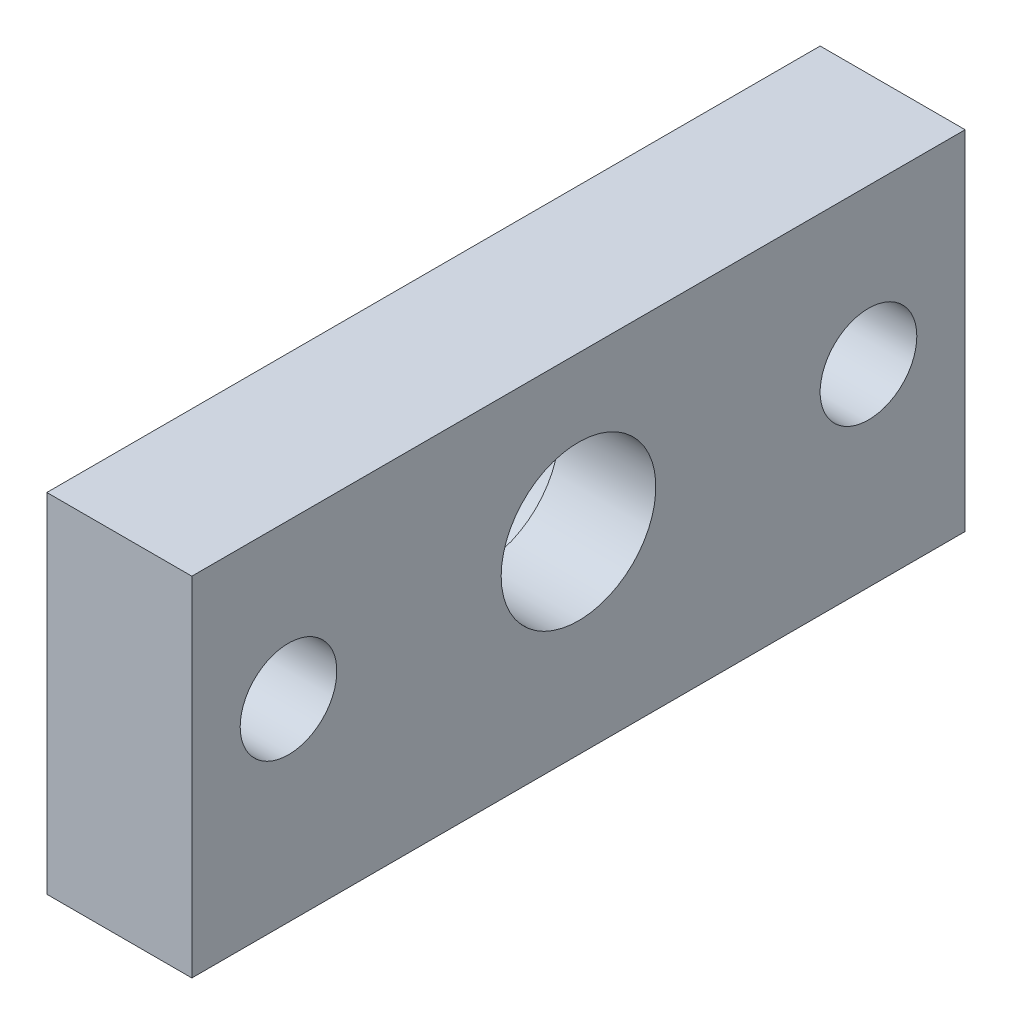
ISO-10303-21;
HEADER;
FILE_DESCRIPTION(('STEP AP214'),'2;1');
FILE_NAME('part.step','',(''),(''),'','','');
FILE_SCHEMA(('AUTOMOTIVE_DESIGN { 1 0 10303 214 1 1 1 1 }'));
ENDSEC;
DATA;
#1=APPLICATION_CONTEXT('core data for automotive mechanical design processes');
#2=APPLICATION_PROTOCOL_DEFINITION('international standard','automotive_design',2000,#1);
#3=PRODUCT_CONTEXT('',#1,'mechanical');
#4=PRODUCT('Part','Part','',(#3));
#5=PRODUCT_RELATED_PRODUCT_CATEGORY('part','',(#4));
#6=PRODUCT_DEFINITION_FORMATION('','',#4);
#7=PRODUCT_DEFINITION_CONTEXT('part definition',#1,'design');
#8=PRODUCT_DEFINITION('design','',#6,#7);
#9=PRODUCT_DEFINITION_SHAPE('','',#8);
#10=(LENGTH_UNIT() NAMED_UNIT(*) SI_UNIT(.MILLI.,.METRE.));
#11=(NAMED_UNIT(*) PLANE_ANGLE_UNIT() SI_UNIT($,.RADIAN.));
#12=(NAMED_UNIT(*) SI_UNIT($,.STERADIAN.) SOLID_ANGLE_UNIT());
#13=UNCERTAINTY_MEASURE_WITH_UNIT(LENGTH_MEASURE(1.E-05),#10,'distance_accuracy_value','');
#14=(GEOMETRIC_REPRESENTATION_CONTEXT(3) GLOBAL_UNCERTAINTY_ASSIGNED_CONTEXT((#13)) GLOBAL_UNIT_ASSIGNED_CONTEXT((#10,
#11,#12)) REPRESENTATION_CONTEXT('',''));
#15=CARTESIAN_POINT('',(0.,0.,0.));
#16=DIRECTION('',(0.,0.,1.));
#17=DIRECTION('',(1.,0.,0.));
#18=AXIS2_PLACEMENT_3D('',#15,#16,#17);
#19=CARTESIAN_POINT('',(15.,-18.,-40.));
#20=DIRECTION('',(0.,0.,1.));
#21=DIRECTION('',(1.,0.,0.));
#22=AXIS2_PLACEMENT_3D('',#19,#20,#21);
#23=PLANE('',#22);
#24=DIRECTION('',(0.,1.,0.));
#25=VECTOR('',#24,1.);
#26=CARTESIAN_POINT('',(0.,-18.,-40.));
#27=LINE('',#26,#25);
#28=CARTESIAN_POINT('',(0.,-18.,-40.));
#29=VERTEX_POINT('',#28);
#30=CARTESIAN_POINT('',(0.,18.,-40.));
#31=VERTEX_POINT('',#30);
#32=EDGE_CURVE('E140',#29,#31,#27,.T.);
#33=ORIENTED_EDGE('',*,*,#32,.T.);
#34=DIRECTION('',(-1.,0.,0.));
#35=VECTOR('',#34,1.);
#36=CARTESIAN_POINT('',(15.,18.,-40.));
#37=LINE('',#36,#35);
#38=CARTESIAN_POINT('',(15.,18.,-40.));
#39=VERTEX_POINT('',#38);
#40=EDGE_CURVE('E11',#39,#31,#37,.T.);
#41=ORIENTED_EDGE('',*,*,#40,.F.);
#42=DIRECTION('',(0.,1.,0.));
#43=VECTOR('',#42,1.);
#44=CARTESIAN_POINT('',(15.,-18.,-40.));
#45=LINE('',#44,#43);
#46=CARTESIAN_POINT('',(15.,-18.,-40.));
#47=VERTEX_POINT('',#46);
#48=EDGE_CURVE('E141',#47,#39,#45,.T.);
#49=ORIENTED_EDGE('',*,*,#48,.F.);
#50=DIRECTION('',(-1.,0.,0.));
#51=VECTOR('',#50,1.);
#52=CARTESIAN_POINT('',(15.,-18.,-40.));
#53=LINE('',#52,#51);
#54=EDGE_CURVE('E147',#47,#29,#53,.T.);
#55=ORIENTED_EDGE('',*,*,#54,.T.);
#56=EDGE_LOOP('',(#33,#41,#49,#55));
#57=FACE_BOUND('',#56,.T.);
#58=ADVANCED_FACE('F45',(#57),#23,.F.);
#59=CARTESIAN_POINT('',(15.,18.,40.));
#60=DIRECTION('',(0.,-1.,0.));
#61=DIRECTION('',(0.,0.,-1.));
#62=AXIS2_PLACEMENT_3D('',#59,#60,#61);
#63=PLANE('',#62);
#64=DIRECTION('',(0.,0.,1.));
#65=VECTOR('',#64,1.);
#66=CARTESIAN_POINT('',(0.,18.,40.));
#67=LINE('',#66,#65);
#68=CARTESIAN_POINT('',(0.,18.,40.));
#69=VERTEX_POINT('',#68);
#70=EDGE_CURVE('E150',#31,#69,#67,.T.);
#71=ORIENTED_EDGE('',*,*,#70,.T.);
#72=DIRECTION('',(-1.,0.,0.));
#73=VECTOR('',#72,1.);
#74=CARTESIAN_POINT('',(15.,18.,40.));
#75=LINE('',#74,#73);
#76=CARTESIAN_POINT('',(15.,18.,40.));
#77=VERTEX_POINT('',#76);
#78=EDGE_CURVE('E53',#77,#69,#75,.T.);
#79=ORIENTED_EDGE('',*,*,#78,.F.);
#80=DIRECTION('',(0.,0.,1.));
#81=VECTOR('',#80,1.);
#82=CARTESIAN_POINT('',(15.,18.,40.));
#83=LINE('',#82,#81);
#84=EDGE_CURVE('E92',#39,#77,#83,.T.);
#85=ORIENTED_EDGE('',*,*,#84,.F.);
#86=ORIENTED_EDGE('',*,*,#40,.T.);
#87=EDGE_LOOP('',(#71,#79,#85,#86));
#88=FACE_BOUND('',#87,.T.);
#89=ADVANCED_FACE('F176',(#88),#63,.F.);
#90=CARTESIAN_POINT('',(15.,-18.,40.));
#91=DIRECTION('',(0.,0.,-1.));
#92=DIRECTION('',(0.,1.,0.));
#93=AXIS2_PLACEMENT_3D('',#90,#91,#92);
#94=PLANE('',#93);
#95=DIRECTION('',(0.,-1.,0.));
#96=VECTOR('',#95,1.);
#97=CARTESIAN_POINT('',(0.,-18.,40.));
#98=LINE('',#97,#96);
#99=CARTESIAN_POINT('',(0.,-18.,40.));
#100=VERTEX_POINT('',#99);
#101=EDGE_CURVE('E79',#69,#100,#98,.T.);
#102=ORIENTED_EDGE('',*,*,#101,.T.);
#103=DIRECTION('',(-1.,0.,0.));
#104=VECTOR('',#103,1.);
#105=CARTESIAN_POINT('',(15.,-18.,40.));
#106=LINE('',#105,#104);
#107=CARTESIAN_POINT('',(15.,-18.,40.));
#108=VERTEX_POINT('',#107);
#109=EDGE_CURVE('E155',#108,#100,#106,.T.);
#110=ORIENTED_EDGE('',*,*,#109,.F.);
#111=DIRECTION('',(0.,-1.,0.));
#112=VECTOR('',#111,1.);
#113=CARTESIAN_POINT('',(15.,-18.,40.));
#114=LINE('',#113,#112);
#115=EDGE_CURVE('E144',#77,#108,#114,.T.);
#116=ORIENTED_EDGE('',*,*,#115,.F.);
#117=ORIENTED_EDGE('',*,*,#78,.T.);
#118=EDGE_LOOP('',(#102,#110,#116,#117));
#119=FACE_BOUND('',#118,.T.);
#120=ADVANCED_FACE('F157',(#119),#94,.F.);
#121=CARTESIAN_POINT('',(15.,-18.,40.));
#122=DIRECTION('',(0.,1.,0.));
#123=DIRECTION('',(0.,0.,1.));
#124=AXIS2_PLACEMENT_3D('',#121,#122,#123);
#125=PLANE('',#124);
#126=CARTESIAN_POINT('',(7.5,-18.,30.));
#127=DIRECTION('',(0.,-1.,0.));
#128=DIRECTION('',(0.,0.,-1.));
#129=AXIS2_PLACEMENT_3D('',#126,#127,#128);
#130=CIRCLE('',#129,2.49999999999999);
#131=CARTESIAN_POINT('',(7.5,-18.,27.5));
#132=VERTEX_POINT('',#131);
#133=EDGE_CURVE('E116',#132,#132,#130,.T.);
#134=ORIENTED_EDGE('',*,*,#133,.F.);
#135=EDGE_LOOP('',(#134));
#136=FACE_BOUND('',#135,.T.);
#137=CARTESIAN_POINT('',(7.5,-18.,10.));
#138=DIRECTION('',(0.,-1.,0.));
#139=DIRECTION('',(0.,0.,-1.));
#140=AXIS2_PLACEMENT_3D('',#137,#138,#139);
#141=CIRCLE('',#140,2.49999999999999);
#142=CARTESIAN_POINT('',(7.5,-18.,7.50000000000001));
#143=VERTEX_POINT('',#142);
#144=EDGE_CURVE('E115',#143,#143,#141,.T.);
#145=ORIENTED_EDGE('',*,*,#144,.F.);
#146=EDGE_LOOP('',(#145));
#147=FACE_BOUND('',#146,.T.);
#148=CARTESIAN_POINT('',(7.5,-18.,-10.));
#149=DIRECTION('',(0.,-1.,0.));
#150=DIRECTION('',(0.,0.,-1.));
#151=AXIS2_PLACEMENT_3D('',#148,#149,#150);
#152=CIRCLE('',#151,2.49999999999999);
#153=CARTESIAN_POINT('',(7.5,-18.,-12.5));
#154=VERTEX_POINT('',#153);
#155=EDGE_CURVE('E128',#154,#154,#152,.T.);
#156=ORIENTED_EDGE('',*,*,#155,.F.);
#157=EDGE_LOOP('',(#156));
#158=FACE_BOUND('',#157,.T.);
#159=CARTESIAN_POINT('',(7.5,-18.,-30.));
#160=DIRECTION('',(0.,-1.,0.));
#161=DIRECTION('',(0.,0.,-1.));
#162=AXIS2_PLACEMENT_3D('',#159,#160,#161);
#163=CIRCLE('',#162,2.49999999999999);
#164=CARTESIAN_POINT('',(7.5,-18.,-32.5));
#165=VERTEX_POINT('',#164);
#166=EDGE_CURVE('E134',#165,#165,#163,.T.);
#167=ORIENTED_EDGE('',*,*,#166,.F.);
#168=EDGE_LOOP('',(#167));
#169=FACE_BOUND('',#168,.T.);
#170=DIRECTION('',(0.,0.,-1.));
#171=VECTOR('',#170,1.);
#172=CARTESIAN_POINT('',(0.,-18.,40.));
#173=LINE('',#172,#171);
#174=EDGE_CURVE('E85',#100,#29,#173,.T.);
#175=ORIENTED_EDGE('',*,*,#174,.T.);
#176=ORIENTED_EDGE('',*,*,#54,.F.);
#177=DIRECTION('',(0.,0.,-1.));
#178=VECTOR('',#177,1.);
#179=CARTESIAN_POINT('',(15.,-18.,40.));
#180=LINE('',#179,#178);
#181=EDGE_CURVE('E61',#108,#47,#180,.T.);
#182=ORIENTED_EDGE('',*,*,#181,.F.);
#183=ORIENTED_EDGE('',*,*,#109,.T.);
#184=EDGE_LOOP('',(#175,#176,#182,#183));
#185=FACE_BOUND('',#184,.T.);
#186=ADVANCED_FACE('F164',(#136,#147,#158,#169,#185),#125,.F.);
#187=CARTESIAN_POINT('',(15.,0.,0.));
#188=DIRECTION('',(-1.,0.,0.));
#189=DIRECTION('',(0.,0.,1.));
#190=AXIS2_PLACEMENT_3D('',#187,#188,#189);
#191=PLANE('',#190);
#192=CARTESIAN_POINT('',(15.,2.,0.));
#193=DIRECTION('',(-1.,0.,0.));
#194=DIRECTION('',(0.,0.,1.));
#195=AXIS2_PLACEMENT_3D('',#192,#193,#194);
#196=CIRCLE('',#195,8.);
#197=CARTESIAN_POINT('',(15.,2.,8.));
#198=VERTEX_POINT('',#197);
#199=EDGE_CURVE('E347',#198,#198,#196,.T.);
#200=ORIENTED_EDGE('',*,*,#199,.T.);
#201=EDGE_LOOP('',(#200));
#202=FACE_BOUND('',#201,.T.);
#203=CARTESIAN_POINT('',(15.,1.99999999999954,-30.));
#204=DIRECTION('',(1.,0.,0.));
#205=DIRECTION('',(0.,0.,-1.));
#206=AXIS2_PLACEMENT_3D('',#203,#204,#205);
#207=CIRCLE('',#206,5.);
#208=CARTESIAN_POINT('',(15.,1.99999999999954,-35.));
#209=VERTEX_POINT('',#208);
#210=EDGE_CURVE('E355',#209,#209,#207,.T.);
#211=ORIENTED_EDGE('',*,*,#210,.F.);
#212=EDGE_LOOP('',(#211));
#213=FACE_BOUND('',#212,.T.);
#214=CARTESIAN_POINT('',(15.,1.99999999999954,30.));
#215=DIRECTION('',(-1.,0.,0.));
#216=DIRECTION('',(0.,0.,1.));
#217=AXIS2_PLACEMENT_3D('',#214,#215,#216);
#218=CIRCLE('',#217,5.);
#219=CARTESIAN_POINT('',(15.,1.99999999999954,35.));
#220=VERTEX_POINT('',#219);
#221=EDGE_CURVE('E361',#220,#220,#218,.T.);
#222=ORIENTED_EDGE('',*,*,#221,.T.);
#223=EDGE_LOOP('',(#222));
#224=FACE_BOUND('',#223,.T.);
#225=ORIENTED_EDGE('',*,*,#48,.T.);
#226=ORIENTED_EDGE('',*,*,#84,.T.);
#227=ORIENTED_EDGE('',*,*,#115,.T.);
#228=ORIENTED_EDGE('',*,*,#181,.T.);
#229=EDGE_LOOP('',(#225,#226,#227,#228));
#230=FACE_BOUND('',#229,.T.);
#231=ADVANCED_FACE('F166',(#202,#213,#224,#230),#191,.F.);
#232=CARTESIAN_POINT('',(0.,0.,0.));
#233=DIRECTION('',(-1.,0.,0.));
#234=DIRECTION('',(0.,0.,1.));
#235=AXIS2_PLACEMENT_3D('',#232,#233,#234);
#236=PLANE('',#235);
#237=CARTESIAN_POINT('',(0.,1.99999999999954,-30.));
#238=DIRECTION('',(1.,0.,0.));
#239=DIRECTION('',(0.,0.,-1.));
#240=AXIS2_PLACEMENT_3D('',#237,#238,#239);
#241=CIRCLE('',#240,5.);
#242=CARTESIAN_POINT('',(0.,1.99999999999954,-35.));
#243=VERTEX_POINT('',#242);
#244=EDGE_CURVE('E352',#243,#243,#241,.T.);
#245=ORIENTED_EDGE('',*,*,#244,.T.);
#246=EDGE_LOOP('',(#245));
#247=FACE_BOUND('',#246,.T.);
#248=CARTESIAN_POINT('',(0.,1.99999999999954,30.));
#249=DIRECTION('',(-1.,0.,0.));
#250=DIRECTION('',(0.,0.,1.));
#251=AXIS2_PLACEMENT_3D('',#248,#249,#250);
#252=CIRCLE('',#251,5.);
#253=CARTESIAN_POINT('',(0.,1.99999999999954,35.));
#254=VERTEX_POINT('',#253);
#255=EDGE_CURVE('E358',#254,#254,#252,.T.);
#256=ORIENTED_EDGE('',*,*,#255,.F.);
#257=EDGE_LOOP('',(#256));
#258=FACE_BOUND('',#257,.T.);
#259=CARTESIAN_POINT('',(0.,2.,0.));
#260=DIRECTION('',(-1.,0.,0.));
#261=DIRECTION('',(0.,0.,1.));
#262=AXIS2_PLACEMENT_3D('',#259,#260,#261);
#263=CIRCLE('',#262,12.);
#264=CARTESIAN_POINT('',(0.,2.,12.));
#265=VERTEX_POINT('',#264);
#266=EDGE_CURVE('E364',#265,#265,#263,.T.);
#267=ORIENTED_EDGE('',*,*,#266,.F.);
#268=EDGE_LOOP('',(#267));
#269=FACE_BOUND('',#268,.T.);
#270=ORIENTED_EDGE('',*,*,#32,.F.);
#271=ORIENTED_EDGE('',*,*,#174,.F.);
#272=ORIENTED_EDGE('',*,*,#101,.F.);
#273=ORIENTED_EDGE('',*,*,#70,.F.);
#274=EDGE_LOOP('',(#270,#271,#272,#273));
#275=FACE_BOUND('',#274,.T.);
#276=ADVANCED_FACE('F160',(#247,#258,#269,#275),#236,.T.);
#277=CARTESIAN_POINT('',(7.5,-9.99999999999999,-30.));
#278=DIRECTION('',(0.,-1.,0.));
#279=DIRECTION('',(0.,0.,-1.));
#280=AXIS2_PLACEMENT_3D('',#277,#278,#279);
#281=CONICAL_SURFACE('',#280,2.5,1.02974425867665);
#282=CARTESIAN_POINT('',(7.5,-8.49784845243109,-30.));
#283=VERTEX_POINT('',#282);
#284=VERTEX_LOOP('',#283);
#285=FACE_BOUND('',#284,.T.);
#286=CARTESIAN_POINT('',(7.5,-9.99999999999999,-30.));
#287=DIRECTION('',(0.,-1.,0.));
#288=DIRECTION('',(0.,0.,-1.));
#289=AXIS2_PLACEMENT_3D('',#286,#287,#288);
#290=CIRCLE('',#289,2.5);
#291=CARTESIAN_POINT('',(7.5,-9.99999999999999,-32.5));
#292=VERTEX_POINT('',#291);
#293=EDGE_CURVE('E137',#292,#292,#290,.T.);
#294=ORIENTED_EDGE('',*,*,#293,.T.);
#295=EDGE_LOOP('',(#294));
#296=FACE_BOUND('',#295,.T.);
#297=ADVANCED_FACE('F214',(#285,#296),#281,.F.);
#298=CARTESIAN_POINT('',(7.5,-18.,-30.));
#299=DIRECTION('',(0.,-1.,0.));
#300=DIRECTION('',(0.,0.,-1.));
#301=AXIS2_PLACEMENT_3D('',#298,#299,#300);
#302=CYLINDRICAL_SURFACE('',#301,2.49999999999999);
#303=ORIENTED_EDGE('',*,*,#293,.F.);
#304=EDGE_LOOP('',(#303));
#305=FACE_BOUND('',#304,.T.);
#306=ORIENTED_EDGE('',*,*,#166,.T.);
#307=EDGE_LOOP('',(#306));
#308=FACE_BOUND('',#307,.T.);
#309=ADVANCED_FACE('F223',(#305,#308),#302,.F.);
#310=CARTESIAN_POINT('',(7.5,-9.99999999999999,-10.));
#311=DIRECTION('',(0.,-1.,0.));
#312=DIRECTION('',(0.,0.,-1.));
#313=AXIS2_PLACEMENT_3D('',#310,#311,#312);
#314=CONICAL_SURFACE('',#313,2.5,1.02974425867665);
#315=CARTESIAN_POINT('',(7.5,-8.49784845243109,-10.));
#316=VERTEX_POINT('',#315);
#317=VERTEX_LOOP('',#316);
#318=FACE_BOUND('',#317,.T.);
#319=CARTESIAN_POINT('',(7.5,-9.99999999999999,-10.));
#320=DIRECTION('',(0.,-1.,0.));
#321=DIRECTION('',(0.,0.,-1.));
#322=AXIS2_PLACEMENT_3D('',#319,#320,#321);
#323=CIRCLE('',#322,2.5);
#324=CARTESIAN_POINT('',(7.5,-9.99999999999999,-12.5));
#325=VERTEX_POINT('',#324);
#326=EDGE_CURVE('E131',#325,#325,#323,.T.);
#327=ORIENTED_EDGE('',*,*,#326,.T.);
#328=EDGE_LOOP('',(#327));
#329=FACE_BOUND('',#328,.T.);
#330=ADVANCED_FACE('F234',(#318,#329),#314,.F.);
#331=CARTESIAN_POINT('',(7.5,-18.,-10.));
#332=DIRECTION('',(0.,-1.,0.));
#333=DIRECTION('',(0.,0.,-1.));
#334=AXIS2_PLACEMENT_3D('',#331,#332,#333);
#335=CYLINDRICAL_SURFACE('',#334,2.49999999999999);
#336=ORIENTED_EDGE('',*,*,#326,.F.);
#337=EDGE_LOOP('',(#336));
#338=FACE_BOUND('',#337,.T.);
#339=ORIENTED_EDGE('',*,*,#155,.T.);
#340=EDGE_LOOP('',(#339));
#341=FACE_BOUND('',#340,.T.);
#342=ADVANCED_FACE('F245',(#338,#341),#335,.F.);
#343=CARTESIAN_POINT('',(7.5,-9.99999999999999,10.));
#344=DIRECTION('',(0.,-1.,0.));
#345=DIRECTION('',(0.,0.,-1.));
#346=AXIS2_PLACEMENT_3D('',#343,#344,#345);
#347=CONICAL_SURFACE('',#346,2.5,1.02974425867665);
#348=CARTESIAN_POINT('',(7.5,-8.49784845243109,10.));
#349=VERTEX_POINT('',#348);
#350=VERTEX_LOOP('',#349);
#351=FACE_BOUND('',#350,.T.);
#352=CARTESIAN_POINT('',(7.5,-9.99999999999999,10.));
#353=DIRECTION('',(0.,-1.,0.));
#354=DIRECTION('',(0.,0.,-1.));
#355=AXIS2_PLACEMENT_3D('',#352,#353,#354);
#356=CIRCLE('',#355,2.5);
#357=CARTESIAN_POINT('',(7.5,-9.99999999999999,7.5));
#358=VERTEX_POINT('',#357);
#359=EDGE_CURVE('E119',#358,#358,#356,.T.);
#360=ORIENTED_EDGE('',*,*,#359,.T.);
#361=EDGE_LOOP('',(#360));
#362=FACE_BOUND('',#361,.T.);
#363=ADVANCED_FACE('F256',(#351,#362),#347,.F.);
#364=CARTESIAN_POINT('',(7.5,-18.,10.));
#365=DIRECTION('',(0.,-1.,0.));
#366=DIRECTION('',(0.,0.,-1.));
#367=AXIS2_PLACEMENT_3D('',#364,#365,#366);
#368=CYLINDRICAL_SURFACE('',#367,2.49999999999999);
#369=ORIENTED_EDGE('',*,*,#359,.F.);
#370=EDGE_LOOP('',(#369));
#371=FACE_BOUND('',#370,.T.);
#372=ORIENTED_EDGE('',*,*,#144,.T.);
#373=EDGE_LOOP('',(#372));
#374=FACE_BOUND('',#373,.T.);
#375=ADVANCED_FACE('F109',(#371,#374),#368,.F.);
#376=CARTESIAN_POINT('',(7.5,-9.99999999999999,30.));
#377=DIRECTION('',(0.,-1.,0.));
#378=DIRECTION('',(0.,0.,-1.));
#379=AXIS2_PLACEMENT_3D('',#376,#377,#378);
#380=CONICAL_SURFACE('',#379,2.5,1.02974425867665);
#381=CARTESIAN_POINT('',(7.5,-8.49784845243109,30.));
#382=VERTEX_POINT('',#381);
#383=VERTEX_LOOP('',#382);
#384=FACE_BOUND('',#383,.T.);
#385=CARTESIAN_POINT('',(7.5,-9.99999999999999,30.));
#386=DIRECTION('',(0.,-1.,0.));
#387=DIRECTION('',(0.,0.,-1.));
#388=AXIS2_PLACEMENT_3D('',#385,#386,#387);
#389=CIRCLE('',#388,2.5);
#390=CARTESIAN_POINT('',(7.5,-9.99999999999999,27.5));
#391=VERTEX_POINT('',#390);
#392=EDGE_CURVE('E113',#391,#391,#389,.T.);
#393=ORIENTED_EDGE('',*,*,#392,.T.);
#394=EDGE_LOOP('',(#393));
#395=FACE_BOUND('',#394,.T.);
#396=ADVANCED_FACE('F105',(#384,#395),#380,.F.);
#397=CARTESIAN_POINT('',(7.5,-18.,30.));
#398=DIRECTION('',(0.,-1.,0.));
#399=DIRECTION('',(0.,0.,-1.));
#400=AXIS2_PLACEMENT_3D('',#397,#398,#399);
#401=CYLINDRICAL_SURFACE('',#400,2.49999999999999);
#402=ORIENTED_EDGE('',*,*,#392,.F.);
#403=EDGE_LOOP('',(#402));
#404=FACE_BOUND('',#403,.T.);
#405=ORIENTED_EDGE('',*,*,#133,.T.);
#406=EDGE_LOOP('',(#405));
#407=FACE_BOUND('',#406,.T.);
#408=ADVANCED_FACE('F108',(#404,#407),#401,.F.);
#409=CARTESIAN_POINT('',(5.,2.,0.));
#410=DIRECTION('',(-1.,0.,0.));
#411=DIRECTION('',(0.,0.,1.));
#412=AXIS2_PLACEMENT_3D('',#409,#410,#411);
#413=CYLINDRICAL_SURFACE('',#412,12.);
#414=CARTESIAN_POINT('',(5.,2.,0.));
#415=DIRECTION('',(-1.,0.,0.));
#416=DIRECTION('',(0.,0.,1.));
#417=AXIS2_PLACEMENT_3D('',#414,#415,#416);
#418=CIRCLE('',#417,12.);
#419=CARTESIAN_POINT('',(5.,2.,12.));
#420=VERTEX_POINT('',#419);
#421=EDGE_CURVE('E122',#420,#420,#418,.T.);
#422=ORIENTED_EDGE('',*,*,#421,.F.);
#423=EDGE_LOOP('',(#422));
#424=FACE_BOUND('',#423,.T.);
#425=ORIENTED_EDGE('',*,*,#266,.T.);
#426=EDGE_LOOP('',(#425));
#427=FACE_BOUND('',#426,.T.);
#428=ADVANCED_FACE('F294',(#424,#427),#413,.F.);
#429=CARTESIAN_POINT('',(5.,2.,0.));
#430=DIRECTION('',(-1.,0.,0.));
#431=DIRECTION('',(0.,0.,1.));
#432=AXIS2_PLACEMENT_3D('',#429,#430,#431);
#433=PLANE('',#432);
#434=CARTESIAN_POINT('',(5.,2.,0.));
#435=DIRECTION('',(-1.,0.,0.));
#436=DIRECTION('',(0.,0.,1.));
#437=AXIS2_PLACEMENT_3D('',#434,#435,#436);
#438=CIRCLE('',#437,8.);
#439=CARTESIAN_POINT('',(5.,2.,8.));
#440=VERTEX_POINT('',#439);
#441=EDGE_CURVE('E350',#440,#440,#438,.T.);
#442=ORIENTED_EDGE('',*,*,#441,.F.);
#443=EDGE_LOOP('',(#442));
#444=FACE_BOUND('',#443,.T.);
#445=ORIENTED_EDGE('',*,*,#421,.T.);
#446=EDGE_LOOP('',(#445));
#447=FACE_BOUND('',#446,.T.);
#448=ADVANCED_FACE('F304',(#444,#447),#433,.T.);
#449=CARTESIAN_POINT('',(15.,1.99999999999954,30.));
#450=DIRECTION('',(-1.,0.,0.));
#451=DIRECTION('',(0.,0.,1.));
#452=AXIS2_PLACEMENT_3D('',#449,#450,#451);
#453=CYLINDRICAL_SURFACE('',#452,5.);
#454=ORIENTED_EDGE('',*,*,#221,.F.);
#455=EDGE_LOOP('',(#454));
#456=FACE_BOUND('',#455,.T.);
#457=ORIENTED_EDGE('',*,*,#255,.T.);
#458=EDGE_LOOP('',(#457));
#459=FACE_BOUND('',#458,.T.);
#460=ADVANCED_FACE('F313',(#456,#459),#453,.F.);
#461=CARTESIAN_POINT('',(15.,1.99999999999954,-30.));
#462=DIRECTION('',(-1.,0.,0.));
#463=DIRECTION('',(0.,0.,1.));
#464=AXIS2_PLACEMENT_3D('',#461,#462,#463);
#465=CYLINDRICAL_SURFACE('',#464,5.);
#466=ORIENTED_EDGE('',*,*,#210,.T.);
#467=EDGE_LOOP('',(#466));
#468=FACE_BOUND('',#467,.T.);
#469=ORIENTED_EDGE('',*,*,#244,.F.);
#470=EDGE_LOOP('',(#469));
#471=FACE_BOUND('',#470,.T.);
#472=ADVANCED_FACE('F323',(#468,#471),#465,.F.);
#473=CARTESIAN_POINT('',(15.,2.,0.));
#474=DIRECTION('',(-1.,0.,0.));
#475=DIRECTION('',(0.,0.,1.));
#476=AXIS2_PLACEMENT_3D('',#473,#474,#475);
#477=CYLINDRICAL_SURFACE('',#476,8.);
#478=ORIENTED_EDGE('',*,*,#199,.F.);
#479=EDGE_LOOP('',(#478));
#480=FACE_BOUND('',#479,.T.);
#481=ORIENTED_EDGE('',*,*,#441,.T.);
#482=EDGE_LOOP('',(#481));
#483=FACE_BOUND('',#482,.T.);
#484=ADVANCED_FACE('F332',(#480,#483),#477,.F.);
#485=CLOSED_SHELL('',(#58,#89,#120,#186,#231,#276,#297,#309,#330,#342,#363,#375,#396,#408,#428,
#448,#460,#472,#484));
#486=MANIFOLD_SOLID_BREP('B2',#485);
#487=ADVANCED_BREP_SHAPE_REPRESENTATION('',(#18,#486),#14);
#488=SHAPE_DEFINITION_REPRESENTATION(#9,#487);
ENDSEC;
END-ISO-10303-21;
